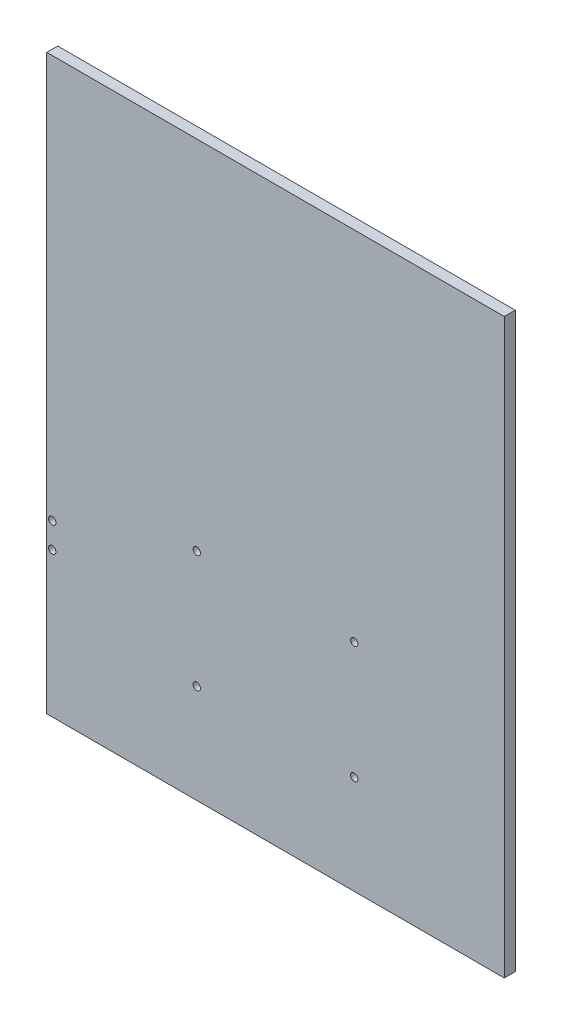
ISO-10303-21;
HEADER;
FILE_DESCRIPTION(('STEP AP214'),'2;1');
FILE_NAME('part.step','',(''),(''),'','','');
FILE_SCHEMA(('AUTOMOTIVE_DESIGN { 1 0 10303 214 1 1 1 1 }'));
ENDSEC;
DATA;
#1=APPLICATION_CONTEXT('core data for automotive mechanical design processes');
#2=APPLICATION_PROTOCOL_DEFINITION('international standard','automotive_design',2000,#1);
#3=PRODUCT_CONTEXT('',#1,'mechanical');
#4=PRODUCT('Part','Part','',(#3));
#5=PRODUCT_RELATED_PRODUCT_CATEGORY('part','',(#4));
#6=PRODUCT_DEFINITION_FORMATION('','',#4);
#7=PRODUCT_DEFINITION_CONTEXT('part definition',#1,'design');
#8=PRODUCT_DEFINITION('design','',#6,#7);
#9=PRODUCT_DEFINITION_SHAPE('','',#8);
#10=(LENGTH_UNIT() NAMED_UNIT(*) SI_UNIT(.MILLI.,.METRE.));
#11=(NAMED_UNIT(*) PLANE_ANGLE_UNIT() SI_UNIT($,.RADIAN.));
#12=(NAMED_UNIT(*) SI_UNIT($,.STERADIAN.) SOLID_ANGLE_UNIT());
#13=UNCERTAINTY_MEASURE_WITH_UNIT(LENGTH_MEASURE(1.E-05),#10,'distance_accuracy_value','');
#14=(GEOMETRIC_REPRESENTATION_CONTEXT(3) GLOBAL_UNCERTAINTY_ASSIGNED_CONTEXT((#13)) GLOBAL_UNIT_ASSIGNED_CONTEXT((#10,
#11,#12)) REPRESENTATION_CONTEXT('',''));
#15=CARTESIAN_POINT('',(0.,0.,0.));
#16=DIRECTION('',(0.,0.,1.));
#17=DIRECTION('',(1.,0.,0.));
#18=AXIS2_PLACEMENT_3D('',#15,#16,#17);
#19=CARTESIAN_POINT('',(-200.,141.,6.));
#20=DIRECTION('',(1.,0.,0.));
#21=DIRECTION('',(0.,1.,0.));
#22=AXIS2_PLACEMENT_3D('',#19,#20,#21);
#23=PLANE('',#22);
#24=DIRECTION('',(0.,-1.,0.));
#25=VECTOR('',#24,1.);
#26=CARTESIAN_POINT('',(-200.,141.,0.));
#27=LINE('',#26,#25);
#28=CARTESIAN_POINT('',(-200.,141.,0.));
#29=VERTEX_POINT('',#28);
#30=CARTESIAN_POINT('',(-200.,-172.,0.));
#31=VERTEX_POINT('',#30);
#32=EDGE_CURVE('E96',#29,#31,#27,.T.);
#33=ORIENTED_EDGE('',*,*,#32,.T.);
#34=DIRECTION('',(0.,0.,-1.));
#35=VECTOR('',#34,1.);
#36=CARTESIAN_POINT('',(-200.,-172.,6.));
#37=LINE('',#36,#35);
#38=CARTESIAN_POINT('',(-200.,-172.,6.));
#39=VERTEX_POINT('',#38);
#40=EDGE_CURVE('E11',#39,#31,#37,.T.);
#41=ORIENTED_EDGE('',*,*,#40,.F.);
#42=DIRECTION('',(0.,-1.,0.));
#43=VECTOR('',#42,1.);
#44=CARTESIAN_POINT('',(-200.,141.,6.));
#45=LINE('',#44,#43);
#46=CARTESIAN_POINT('',(-200.,141.,6.));
#47=VERTEX_POINT('',#46);
#48=EDGE_CURVE('E84',#47,#39,#45,.T.);
#49=ORIENTED_EDGE('',*,*,#48,.F.);
#50=DIRECTION('',(0.,0.,-1.));
#51=VECTOR('',#50,1.);
#52=CARTESIAN_POINT('',(-200.,141.,6.));
#53=LINE('',#52,#51);
#54=EDGE_CURVE('E92',#47,#29,#53,.T.);
#55=ORIENTED_EDGE('',*,*,#54,.T.);
#56=EDGE_LOOP('',(#33,#41,#49,#55));
#57=FACE_BOUND('',#56,.T.);
#58=ADVANCED_FACE('F33',(#57),#23,.F.);
#59=CARTESIAN_POINT('',(-200.,-172.,6.));
#60=DIRECTION('',(0.,1.,0.));
#61=DIRECTION('',(0.,0.,1.));
#62=AXIS2_PLACEMENT_3D('',#59,#60,#61);
#63=PLANE('',#62);
#64=DIRECTION('',(1.,0.,0.));
#65=VECTOR('',#64,1.);
#66=CARTESIAN_POINT('',(-200.,-172.,0.));
#67=LINE('',#66,#65);
#68=CARTESIAN_POINT('',(50.,-172.,0.));
#69=VERTEX_POINT('',#68);
#70=EDGE_CURVE('E88',#31,#69,#67,.T.);
#71=ORIENTED_EDGE('',*,*,#70,.T.);
#72=DIRECTION('',(0.,0.,-1.));
#73=VECTOR('',#72,1.);
#74=CARTESIAN_POINT('',(50.,-172.,6.));
#75=LINE('',#74,#73);
#76=CARTESIAN_POINT('',(50.,-172.,6.));
#77=VERTEX_POINT('',#76);
#78=EDGE_CURVE('E41',#77,#69,#75,.T.);
#79=ORIENTED_EDGE('',*,*,#78,.F.);
#80=DIRECTION('',(1.,0.,0.));
#81=VECTOR('',#80,1.);
#82=CARTESIAN_POINT('',(-200.,-172.,6.));
#83=LINE('',#82,#81);
#84=EDGE_CURVE('E79',#39,#77,#83,.T.);
#85=ORIENTED_EDGE('',*,*,#84,.F.);
#86=ORIENTED_EDGE('',*,*,#40,.T.);
#87=EDGE_LOOP('',(#71,#79,#85,#86));
#88=FACE_BOUND('',#87,.T.);
#89=ADVANCED_FACE('F87',(#88),#63,.F.);
#90=CARTESIAN_POINT('',(50.,141.,6.));
#91=DIRECTION('',(-1.,0.,0.));
#92=DIRECTION('',(0.,-1.,0.));
#93=AXIS2_PLACEMENT_3D('',#90,#91,#92);
#94=PLANE('',#93);
#95=DIRECTION('',(0.,1.,0.));
#96=VECTOR('',#95,1.);
#97=CARTESIAN_POINT('',(50.,141.,0.));
#98=LINE('',#97,#96);
#99=CARTESIAN_POINT('',(50.,141.,0.));
#100=VERTEX_POINT('',#99);
#101=EDGE_CURVE('E66',#69,#100,#98,.T.);
#102=ORIENTED_EDGE('',*,*,#101,.T.);
#103=DIRECTION('',(0.,0.,-1.));
#104=VECTOR('',#103,1.);
#105=CARTESIAN_POINT('',(50.,141.,6.));
#106=LINE('',#105,#104);
#107=CARTESIAN_POINT('',(50.,141.,6.));
#108=VERTEX_POINT('',#107);
#109=EDGE_CURVE('E89',#108,#100,#106,.T.);
#110=ORIENTED_EDGE('',*,*,#109,.F.);
#111=DIRECTION('',(0.,1.,0.));
#112=VECTOR('',#111,1.);
#113=CARTESIAN_POINT('',(50.,141.,6.));
#114=LINE('',#113,#112);
#115=EDGE_CURVE('E82',#77,#108,#114,.T.);
#116=ORIENTED_EDGE('',*,*,#115,.F.);
#117=ORIENTED_EDGE('',*,*,#78,.T.);
#118=EDGE_LOOP('',(#102,#110,#116,#117));
#119=FACE_BOUND('',#118,.T.);
#120=ADVANCED_FACE('F90',(#119),#94,.F.);
#121=CARTESIAN_POINT('',(-200.,141.,6.));
#122=DIRECTION('',(0.,-1.,0.));
#123=DIRECTION('',(0.,0.,-1.));
#124=AXIS2_PLACEMENT_3D('',#121,#122,#123);
#125=PLANE('',#124);
#126=DIRECTION('',(-1.,0.,0.));
#127=VECTOR('',#126,1.);
#128=CARTESIAN_POINT('',(-200.,141.,0.));
#129=LINE('',#128,#127);
#130=EDGE_CURVE('E72',#100,#29,#129,.T.);
#131=ORIENTED_EDGE('',*,*,#130,.T.);
#132=ORIENTED_EDGE('',*,*,#54,.F.);
#133=DIRECTION('',(-1.,0.,0.));
#134=VECTOR('',#133,1.);
#135=CARTESIAN_POINT('',(-200.,141.,6.));
#136=LINE('',#135,#134);
#137=EDGE_CURVE('E49',#108,#47,#136,.T.);
#138=ORIENTED_EDGE('',*,*,#137,.F.);
#139=ORIENTED_EDGE('',*,*,#109,.T.);
#140=EDGE_LOOP('',(#131,#132,#138,#139));
#141=FACE_BOUND('',#140,.T.);
#142=ADVANCED_FACE('F104',(#141),#125,.F.);
#143=CARTESIAN_POINT('',(0.,0.,6.));
#144=DIRECTION('',(0.,0.,1.));
#145=DIRECTION('',(1.,0.,0.));
#146=AXIS2_PLACEMENT_3D('',#143,#144,#145);
#147=PLANE('',#146);
#148=CARTESIAN_POINT('',(-197.,-79.1,6.));
#149=DIRECTION('',(0.,0.,1.));
#150=DIRECTION('',(1.,0.,0.));
#151=AXIS2_PLACEMENT_3D('',#148,#149,#150);
#152=CIRCLE('',#151,2.);
#153=CARTESIAN_POINT('',(-199.,-79.1,6.));
#154=VERTEX_POINT('',#153);
#155=EDGE_CURVE('E140',#154,#154,#152,.F.);
#156=ORIENTED_EDGE('',*,*,#155,.T.);
#157=EDGE_LOOP('',(#156));
#158=FACE_BOUND('',#157,.T.);
#159=CARTESIAN_POINT('',(-197.,-92.9,6.));
#160=DIRECTION('',(0.,0.,1.));
#161=DIRECTION('',(1.,0.,0.));
#162=AXIS2_PLACEMENT_3D('',#159,#160,#161);
#163=CIRCLE('',#162,2.);
#164=CARTESIAN_POINT('',(-199.,-92.9,6.));
#165=VERTEX_POINT('',#164);
#166=EDGE_CURVE('E134',#165,#165,#163,.F.);
#167=ORIENTED_EDGE('',*,*,#166,.T.);
#168=EDGE_LOOP('',(#167));
#169=FACE_BOUND('',#168,.T.);
#170=CARTESIAN_POINT('',(-32.,-118.,6.));
#171=DIRECTION('',(0.,0.,1.));
#172=DIRECTION('',(1.,0.,0.));
#173=AXIS2_PLACEMENT_3D('',#170,#171,#172);
#174=CIRCLE('',#173,2.);
#175=CARTESIAN_POINT('',(-34.,-118.,6.));
#176=VERTEX_POINT('',#175);
#177=EDGE_CURVE('E116',#176,#176,#174,.F.);
#178=ORIENTED_EDGE('',*,*,#177,.T.);
#179=EDGE_LOOP('',(#178));
#180=FACE_BOUND('',#179,.T.);
#181=CARTESIAN_POINT('',(-118.,-118.,6.));
#182=DIRECTION('',(0.,0.,1.));
#183=DIRECTION('',(1.,0.,0.));
#184=AXIS2_PLACEMENT_3D('',#181,#182,#183);
#185=CIRCLE('',#184,2.);
#186=CARTESIAN_POINT('',(-120.,-118.,6.));
#187=VERTEX_POINT('',#186);
#188=EDGE_CURVE('E123',#187,#187,#185,.F.);
#189=ORIENTED_EDGE('',*,*,#188,.T.);
#190=EDGE_LOOP('',(#189));
#191=FACE_BOUND('',#190,.T.);
#192=CARTESIAN_POINT('',(-118.,-54.,6.));
#193=DIRECTION('',(0.,0.,1.));
#194=DIRECTION('',(1.,0.,0.));
#195=AXIS2_PLACEMENT_3D('',#192,#193,#194);
#196=CIRCLE('',#195,2.);
#197=CARTESIAN_POINT('',(-120.,-54.,6.));
#198=VERTEX_POINT('',#197);
#199=EDGE_CURVE('E129',#198,#198,#196,.F.);
#200=ORIENTED_EDGE('',*,*,#199,.T.);
#201=EDGE_LOOP('',(#200));
#202=FACE_BOUND('',#201,.T.);
#203=CARTESIAN_POINT('',(-32.,-54.,6.));
#204=DIRECTION('',(0.,0.,1.));
#205=DIRECTION('',(1.,0.,0.));
#206=AXIS2_PLACEMENT_3D('',#203,#204,#205);
#207=CIRCLE('',#206,2.);
#208=CARTESIAN_POINT('',(-34.,-54.,6.));
#209=VERTEX_POINT('',#208);
#210=EDGE_CURVE('E110',#209,#209,#207,.F.);
#211=ORIENTED_EDGE('',*,*,#210,.T.);
#212=EDGE_LOOP('',(#211));
#213=FACE_BOUND('',#212,.T.);
#214=ORIENTED_EDGE('',*,*,#48,.T.);
#215=ORIENTED_EDGE('',*,*,#84,.T.);
#216=ORIENTED_EDGE('',*,*,#115,.T.);
#217=ORIENTED_EDGE('',*,*,#137,.T.);
#218=EDGE_LOOP('',(#214,#215,#216,#217));
#219=FACE_BOUND('',#218,.T.);
#220=ADVANCED_FACE('F80',(#158,#169,#180,#191,#202,#213,#219),#147,.T.);
#221=CARTESIAN_POINT('',(0.,0.,0.));
#222=DIRECTION('',(0.,0.,1.));
#223=DIRECTION('',(1.,0.,0.));
#224=AXIS2_PLACEMENT_3D('',#221,#222,#223);
#225=PLANE('',#224);
#226=CARTESIAN_POINT('',(-197.,-79.1,0.));
#227=DIRECTION('',(0.,0.,-1.));
#228=DIRECTION('',(-1.,0.,0.));
#229=AXIS2_PLACEMENT_3D('',#226,#227,#228);
#230=CIRCLE('',#229,2.);
#231=CARTESIAN_POINT('',(-199.,-79.1,0.));
#232=VERTEX_POINT('',#231);
#233=EDGE_CURVE('E120',#232,#232,#230,.T.);
#234=ORIENTED_EDGE('',*,*,#233,.F.);
#235=EDGE_LOOP('',(#234));
#236=FACE_BOUND('',#235,.T.);
#237=CARTESIAN_POINT('',(-197.,-92.9,0.));
#238=DIRECTION('',(0.,0.,-1.));
#239=DIRECTION('',(-1.,0.,0.));
#240=AXIS2_PLACEMENT_3D('',#237,#238,#239);
#241=CIRCLE('',#240,2.);
#242=CARTESIAN_POINT('',(-199.,-92.9,0.));
#243=VERTEX_POINT('',#242);
#244=EDGE_CURVE('E137',#243,#243,#241,.T.);
#245=ORIENTED_EDGE('',*,*,#244,.F.);
#246=EDGE_LOOP('',(#245));
#247=FACE_BOUND('',#246,.T.);
#248=CARTESIAN_POINT('',(-32.,-118.,0.));
#249=DIRECTION('',(0.,0.,-1.));
#250=DIRECTION('',(-1.,0.,0.));
#251=AXIS2_PLACEMENT_3D('',#248,#249,#250);
#252=CIRCLE('',#251,2.);
#253=CARTESIAN_POINT('',(-34.,-118.,0.));
#254=VERTEX_POINT('',#253);
#255=EDGE_CURVE('E119',#254,#254,#252,.T.);
#256=ORIENTED_EDGE('',*,*,#255,.F.);
#257=EDGE_LOOP('',(#256));
#258=FACE_BOUND('',#257,.T.);
#259=CARTESIAN_POINT('',(-118.,-118.,0.));
#260=DIRECTION('',(0.,0.,-1.));
#261=DIRECTION('',(-1.,0.,0.));
#262=AXIS2_PLACEMENT_3D('',#259,#260,#261);
#263=CIRCLE('',#262,2.);
#264=CARTESIAN_POINT('',(-120.,-118.,0.));
#265=VERTEX_POINT('',#264);
#266=EDGE_CURVE('E126',#265,#265,#263,.T.);
#267=ORIENTED_EDGE('',*,*,#266,.F.);
#268=EDGE_LOOP('',(#267));
#269=FACE_BOUND('',#268,.T.);
#270=CARTESIAN_POINT('',(-118.,-54.,0.));
#271=DIRECTION('',(0.,0.,-1.));
#272=DIRECTION('',(-1.,0.,0.));
#273=AXIS2_PLACEMENT_3D('',#270,#271,#272);
#274=CIRCLE('',#273,2.);
#275=CARTESIAN_POINT('',(-120.,-54.,0.));
#276=VERTEX_POINT('',#275);
#277=EDGE_CURVE('E113',#276,#276,#274,.T.);
#278=ORIENTED_EDGE('',*,*,#277,.F.);
#279=EDGE_LOOP('',(#278));
#280=FACE_BOUND('',#279,.T.);
#281=CARTESIAN_POINT('',(-32.,-54.,0.));
#282=DIRECTION('',(0.,0.,-1.));
#283=DIRECTION('',(-1.,0.,0.));
#284=AXIS2_PLACEMENT_3D('',#281,#282,#283);
#285=CIRCLE('',#284,2.);
#286=CARTESIAN_POINT('',(-34.,-54.,0.));
#287=VERTEX_POINT('',#286);
#288=EDGE_CURVE('E99',#287,#287,#285,.T.);
#289=ORIENTED_EDGE('',*,*,#288,.F.);
#290=EDGE_LOOP('',(#289));
#291=FACE_BOUND('',#290,.T.);
#292=ORIENTED_EDGE('',*,*,#32,.F.);
#293=ORIENTED_EDGE('',*,*,#130,.F.);
#294=ORIENTED_EDGE('',*,*,#101,.F.);
#295=ORIENTED_EDGE('',*,*,#70,.F.);
#296=EDGE_LOOP('',(#292,#293,#294,#295));
#297=FACE_BOUND('',#296,.T.);
#298=ADVANCED_FACE('F107',(#236,#247,#258,#269,#280,#291,#297),#225,.F.);
#299=CARTESIAN_POINT('',(-32.,-54.,6.001));
#300=DIRECTION('',(0.,0.,-1.));
#301=DIRECTION('',(-1.,0.,0.));
#302=AXIS2_PLACEMENT_3D('',#299,#300,#301);
#303=CYLINDRICAL_SURFACE('',#302,2.);
#304=CARTESIAN_POINT('',(-34.,-54.,6.));
#305=CARTESIAN_POINT('',(-34.,-54.,5.9375));
#306=CARTESIAN_POINT('',(-34.,-54.,5.875));
#307=CARTESIAN_POINT('',(-34.,-54.,5.75));
#308=CARTESIAN_POINT('',(-34.,-54.,5.6875));
#309=CARTESIAN_POINT('',(-34.,-54.,5.5625));
#310=CARTESIAN_POINT('',(-34.,-54.,5.5));
#311=CARTESIAN_POINT('',(-34.,-54.,5.375));
#312=CARTESIAN_POINT('',(-34.,-54.,5.3125));
#313=CARTESIAN_POINT('',(-34.,-54.,5.1875));
#314=CARTESIAN_POINT('',(-34.,-54.,5.125));
#315=CARTESIAN_POINT('',(-34.,-54.,5.));
#316=CARTESIAN_POINT('',(-34.,-54.,4.9375));
#317=CARTESIAN_POINT('',(-34.,-54.,4.8125));
#318=CARTESIAN_POINT('',(-34.,-54.,4.75));
#319=CARTESIAN_POINT('',(-34.,-54.,4.625));
#320=CARTESIAN_POINT('',(-34.,-54.,4.5625));
#321=CARTESIAN_POINT('',(-34.,-54.,4.4375));
#322=CARTESIAN_POINT('',(-34.,-54.,4.375));
#323=CARTESIAN_POINT('',(-34.,-54.,4.25));
#324=CARTESIAN_POINT('',(-34.,-54.,4.1875));
#325=CARTESIAN_POINT('',(-34.,-54.,4.0625));
#326=CARTESIAN_POINT('',(-34.,-54.,4.));
#327=CARTESIAN_POINT('',(-34.,-54.,3.875));
#328=CARTESIAN_POINT('',(-34.,-54.,3.8125));
#329=CARTESIAN_POINT('',(-34.,-54.,3.6875));
#330=CARTESIAN_POINT('',(-34.,-54.,3.625));
#331=CARTESIAN_POINT('',(-34.,-54.,3.5));
#332=CARTESIAN_POINT('',(-34.,-54.,3.4375));
#333=CARTESIAN_POINT('',(-34.,-54.,3.3125));
#334=CARTESIAN_POINT('',(-34.,-54.,3.25));
#335=CARTESIAN_POINT('',(-34.,-54.,3.125));
#336=CARTESIAN_POINT('',(-34.,-54.,3.0625));
#337=CARTESIAN_POINT('',(-34.,-54.,2.9375));
#338=CARTESIAN_POINT('',(-34.,-54.,2.875));
#339=CARTESIAN_POINT('',(-34.,-54.,2.75));
#340=CARTESIAN_POINT('',(-34.,-54.,2.6875));
#341=CARTESIAN_POINT('',(-34.,-54.,2.5625));
#342=CARTESIAN_POINT('',(-34.,-54.,2.5));
#343=CARTESIAN_POINT('',(-34.,-54.,2.375));
#344=CARTESIAN_POINT('',(-34.,-54.,2.3125));
#345=CARTESIAN_POINT('',(-34.,-54.,2.1875));
#346=CARTESIAN_POINT('',(-34.,-54.,2.125));
#347=CARTESIAN_POINT('',(-34.,-54.,2.));
#348=CARTESIAN_POINT('',(-34.,-54.,1.9375));
#349=CARTESIAN_POINT('',(-34.,-54.,1.8125));
#350=CARTESIAN_POINT('',(-34.,-54.,1.75));
#351=CARTESIAN_POINT('',(-34.,-54.,1.625));
#352=CARTESIAN_POINT('',(-34.,-54.,1.5625));
#353=CARTESIAN_POINT('',(-34.,-54.,1.4375));
#354=CARTESIAN_POINT('',(-34.,-54.,1.375));
#355=CARTESIAN_POINT('',(-34.,-54.,1.25));
#356=CARTESIAN_POINT('',(-34.,-54.,1.1875));
#357=CARTESIAN_POINT('',(-34.,-54.,1.0625));
#358=CARTESIAN_POINT('',(-34.,-54.,1.));
#359=CARTESIAN_POINT('',(-34.,-54.,0.875));
#360=CARTESIAN_POINT('',(-34.,-54.,0.8125));
#361=CARTESIAN_POINT('',(-34.,-54.,0.6875));
#362=CARTESIAN_POINT('',(-34.,-54.,0.625));
#363=CARTESIAN_POINT('',(-34.,-54.,0.5));
#364=CARTESIAN_POINT('',(-34.,-54.,0.4375));
#365=CARTESIAN_POINT('',(-34.,-54.,0.3125));
#366=CARTESIAN_POINT('',(-34.,-54.,0.25));
#367=CARTESIAN_POINT('',(-34.,-54.,0.125));
#368=CARTESIAN_POINT('',(-34.,-54.,0.0625000000000001));
#369=CARTESIAN_POINT('',(-34.,-54.,0.));
#370=B_SPLINE_CURVE_WITH_KNOTS('',3,(#304,#305,#306,#307,#308,#309,#310,#311,#312,#313,#314,
#315,#316,#317,#318,#319,#320,#321,#322,#323,#324,#325,#326,#327,#328,#329,#330,#331,#332,#333,
#334,#335,#336,#337,#338,#339,#340,#341,#342,#343,#344,#345,#346,#347,#348,#349,#350,#351,#352,
#353,#354,#355,#356,#357,#358,#359,#360,#361,#362,#363,#364,#365,#366,#367,#368,#369),
.UNSPECIFIED.,.F.,.F.,(4,2,2,2,2,2,2,2,2,2,2,2,2,2,2,2,2,2,2,2,2,2,2,2,2,2,2,2,2,2,2,2,4),(0.,
0.187499999999999,0.374999999999999,0.5625,0.75,0.937499999999999,1.125,1.3125,1.5,1.6875,1.875,
2.0625,2.25,2.4375,2.625,2.8125,3.,3.1875,3.375,3.5625,3.75,3.9375,4.125,4.3125,4.5,4.6875,
4.875,5.0625,5.25,5.4375,5.625,5.8125,6.),.UNSPECIFIED.);
#371=EDGE_CURVE('BSEAM150',#209,#287,#370,.T.);
#372=ORIENTED_EDGE('',*,*,#210,.F.);
#373=ORIENTED_EDGE('',*,*,#288,.T.);
#374=ORIENTED_EDGE('',*,*,#371,.T.);
#375=ORIENTED_EDGE('',*,*,#371,.F.);
#376=EDGE_LOOP('',(#372,#374,#373,#375));
#377=FACE_BOUND('',#376,.T.);
#378=ADVANCED_FACE('F150',(#377),#303,.F.);
#379=CARTESIAN_POINT('',(-118.,-54.,6.001));
#380=DIRECTION('',(0.,0.,-1.));
#381=DIRECTION('',(-1.,0.,0.));
#382=AXIS2_PLACEMENT_3D('',#379,#380,#381);
#383=CYLINDRICAL_SURFACE('',#382,2.);
#384=CARTESIAN_POINT('',(-120.,-54.,6.));
#385=CARTESIAN_POINT('',(-120.,-54.,5.9375));
#386=CARTESIAN_POINT('',(-120.,-54.,5.875));
#387=CARTESIAN_POINT('',(-120.,-54.,5.75));
#388=CARTESIAN_POINT('',(-120.,-54.,5.6875));
#389=CARTESIAN_POINT('',(-120.,-54.,5.5625));
#390=CARTESIAN_POINT('',(-120.,-54.,5.5));
#391=CARTESIAN_POINT('',(-120.,-54.,5.375));
#392=CARTESIAN_POINT('',(-120.,-54.,5.3125));
#393=CARTESIAN_POINT('',(-120.,-54.,5.1875));
#394=CARTESIAN_POINT('',(-120.,-54.,5.125));
#395=CARTESIAN_POINT('',(-120.,-54.,5.));
#396=CARTESIAN_POINT('',(-120.,-54.,4.9375));
#397=CARTESIAN_POINT('',(-120.,-54.,4.8125));
#398=CARTESIAN_POINT('',(-120.,-54.,4.75));
#399=CARTESIAN_POINT('',(-120.,-54.,4.625));
#400=CARTESIAN_POINT('',(-120.,-54.,4.5625));
#401=CARTESIAN_POINT('',(-120.,-54.,4.4375));
#402=CARTESIAN_POINT('',(-120.,-54.,4.375));
#403=CARTESIAN_POINT('',(-120.,-54.,4.25));
#404=CARTESIAN_POINT('',(-120.,-54.,4.1875));
#405=CARTESIAN_POINT('',(-120.,-54.,4.0625));
#406=CARTESIAN_POINT('',(-120.,-54.,4.));
#407=CARTESIAN_POINT('',(-120.,-54.,3.875));
#408=CARTESIAN_POINT('',(-120.,-54.,3.8125));
#409=CARTESIAN_POINT('',(-120.,-54.,3.6875));
#410=CARTESIAN_POINT('',(-120.,-54.,3.625));
#411=CARTESIAN_POINT('',(-120.,-54.,3.5));
#412=CARTESIAN_POINT('',(-120.,-54.,3.4375));
#413=CARTESIAN_POINT('',(-120.,-54.,3.3125));
#414=CARTESIAN_POINT('',(-120.,-54.,3.25));
#415=CARTESIAN_POINT('',(-120.,-54.,3.125));
#416=CARTESIAN_POINT('',(-120.,-54.,3.0625));
#417=CARTESIAN_POINT('',(-120.,-54.,2.9375));
#418=CARTESIAN_POINT('',(-120.,-54.,2.875));
#419=CARTESIAN_POINT('',(-120.,-54.,2.75));
#420=CARTESIAN_POINT('',(-120.,-54.,2.6875));
#421=CARTESIAN_POINT('',(-120.,-54.,2.5625));
#422=CARTESIAN_POINT('',(-120.,-54.,2.5));
#423=CARTESIAN_POINT('',(-120.,-54.,2.375));
#424=CARTESIAN_POINT('',(-120.,-54.,2.3125));
#425=CARTESIAN_POINT('',(-120.,-54.,2.1875));
#426=CARTESIAN_POINT('',(-120.,-54.,2.125));
#427=CARTESIAN_POINT('',(-120.,-54.,2.));
#428=CARTESIAN_POINT('',(-120.,-54.,1.9375));
#429=CARTESIAN_POINT('',(-120.,-54.,1.8125));
#430=CARTESIAN_POINT('',(-120.,-54.,1.75));
#431=CARTESIAN_POINT('',(-120.,-54.,1.625));
#432=CARTESIAN_POINT('',(-120.,-54.,1.5625));
#433=CARTESIAN_POINT('',(-120.,-54.,1.4375));
#434=CARTESIAN_POINT('',(-120.,-54.,1.375));
#435=CARTESIAN_POINT('',(-120.,-54.,1.25));
#436=CARTESIAN_POINT('',(-120.,-54.,1.1875));
#437=CARTESIAN_POINT('',(-120.,-54.,1.0625));
#438=CARTESIAN_POINT('',(-120.,-54.,1.));
#439=CARTESIAN_POINT('',(-120.,-54.,0.875));
#440=CARTESIAN_POINT('',(-120.,-54.,0.8125));
#441=CARTESIAN_POINT('',(-120.,-54.,0.6875));
#442=CARTESIAN_POINT('',(-120.,-54.,0.625));
#443=CARTESIAN_POINT('',(-120.,-54.,0.5));
#444=CARTESIAN_POINT('',(-120.,-54.,0.4375));
#445=CARTESIAN_POINT('',(-120.,-54.,0.3125));
#446=CARTESIAN_POINT('',(-120.,-54.,0.25));
#447=CARTESIAN_POINT('',(-120.,-54.,0.125));
#448=CARTESIAN_POINT('',(-120.,-54.,0.0625000000000001));
#449=CARTESIAN_POINT('',(-120.,-54.,0.));
#450=B_SPLINE_CURVE_WITH_KNOTS('',3,(#384,#385,#386,#387,#388,#389,#390,#391,#392,#393,#394,
#395,#396,#397,#398,#399,#400,#401,#402,#403,#404,#405,#406,#407,#408,#409,#410,#411,#412,#413,
#414,#415,#416,#417,#418,#419,#420,#421,#422,#423,#424,#425,#426,#427,#428,#429,#430,#431,#432,
#433,#434,#435,#436,#437,#438,#439,#440,#441,#442,#443,#444,#445,#446,#447,#448,#449),
.UNSPECIFIED.,.F.,.F.,(4,2,2,2,2,2,2,2,2,2,2,2,2,2,2,2,2,2,2,2,2,2,2,2,2,2,2,2,2,2,2,2,4),(0.,
0.187499999999999,0.374999999999999,0.5625,0.75,0.937499999999999,1.125,1.3125,1.5,1.6875,1.875,
2.0625,2.25,2.4375,2.625,2.8125,3.,3.1875,3.375,3.5625,3.75,3.9375,4.125,4.3125,4.5,4.6875,
4.875,5.0625,5.25,5.4375,5.625,5.8125,6.),.UNSPECIFIED.);
#451=EDGE_CURVE('BSEAM163',#198,#276,#450,.T.);
#452=ORIENTED_EDGE('',*,*,#199,.F.);
#453=ORIENTED_EDGE('',*,*,#277,.T.);
#454=ORIENTED_EDGE('',*,*,#451,.T.);
#455=ORIENTED_EDGE('',*,*,#451,.F.);
#456=EDGE_LOOP('',(#452,#454,#453,#455));
#457=FACE_BOUND('',#456,.T.);
#458=ADVANCED_FACE('F163',(#457),#383,.F.);
#459=CARTESIAN_POINT('',(-118.,-118.,6.001));
#460=DIRECTION('',(0.,0.,-1.));
#461=DIRECTION('',(-1.,0.,0.));
#462=AXIS2_PLACEMENT_3D('',#459,#460,#461);
#463=CYLINDRICAL_SURFACE('',#462,2.);
#464=CARTESIAN_POINT('',(-120.,-118.,6.));
#465=CARTESIAN_POINT('',(-120.,-118.,5.9375));
#466=CARTESIAN_POINT('',(-120.,-118.,5.875));
#467=CARTESIAN_POINT('',(-120.,-118.,5.75));
#468=CARTESIAN_POINT('',(-120.,-118.,5.6875));
#469=CARTESIAN_POINT('',(-120.,-118.,5.5625));
#470=CARTESIAN_POINT('',(-120.,-118.,5.5));
#471=CARTESIAN_POINT('',(-120.,-118.,5.375));
#472=CARTESIAN_POINT('',(-120.,-118.,5.3125));
#473=CARTESIAN_POINT('',(-120.,-118.,5.1875));
#474=CARTESIAN_POINT('',(-120.,-118.,5.125));
#475=CARTESIAN_POINT('',(-120.,-118.,5.));
#476=CARTESIAN_POINT('',(-120.,-118.,4.9375));
#477=CARTESIAN_POINT('',(-120.,-118.,4.8125));
#478=CARTESIAN_POINT('',(-120.,-118.,4.75));
#479=CARTESIAN_POINT('',(-120.,-118.,4.625));
#480=CARTESIAN_POINT('',(-120.,-118.,4.5625));
#481=CARTESIAN_POINT('',(-120.,-118.,4.4375));
#482=CARTESIAN_POINT('',(-120.,-118.,4.375));
#483=CARTESIAN_POINT('',(-120.,-118.,4.25));
#484=CARTESIAN_POINT('',(-120.,-118.,4.1875));
#485=CARTESIAN_POINT('',(-120.,-118.,4.0625));
#486=CARTESIAN_POINT('',(-120.,-118.,4.));
#487=CARTESIAN_POINT('',(-120.,-118.,3.875));
#488=CARTESIAN_POINT('',(-120.,-118.,3.8125));
#489=CARTESIAN_POINT('',(-120.,-118.,3.6875));
#490=CARTESIAN_POINT('',(-120.,-118.,3.625));
#491=CARTESIAN_POINT('',(-120.,-118.,3.5));
#492=CARTESIAN_POINT('',(-120.,-118.,3.4375));
#493=CARTESIAN_POINT('',(-120.,-118.,3.3125));
#494=CARTESIAN_POINT('',(-120.,-118.,3.25));
#495=CARTESIAN_POINT('',(-120.,-118.,3.125));
#496=CARTESIAN_POINT('',(-120.,-118.,3.0625));
#497=CARTESIAN_POINT('',(-120.,-118.,2.9375));
#498=CARTESIAN_POINT('',(-120.,-118.,2.875));
#499=CARTESIAN_POINT('',(-120.,-118.,2.75));
#500=CARTESIAN_POINT('',(-120.,-118.,2.6875));
#501=CARTESIAN_POINT('',(-120.,-118.,2.5625));
#502=CARTESIAN_POINT('',(-120.,-118.,2.5));
#503=CARTESIAN_POINT('',(-120.,-118.,2.375));
#504=CARTESIAN_POINT('',(-120.,-118.,2.3125));
#505=CARTESIAN_POINT('',(-120.,-118.,2.1875));
#506=CARTESIAN_POINT('',(-120.,-118.,2.125));
#507=CARTESIAN_POINT('',(-120.,-118.,2.));
#508=CARTESIAN_POINT('',(-120.,-118.,1.9375));
#509=CARTESIAN_POINT('',(-120.,-118.,1.8125));
#510=CARTESIAN_POINT('',(-120.,-118.,1.75));
#511=CARTESIAN_POINT('',(-120.,-118.,1.625));
#512=CARTESIAN_POINT('',(-120.,-118.,1.5625));
#513=CARTESIAN_POINT('',(-120.,-118.,1.4375));
#514=CARTESIAN_POINT('',(-120.,-118.,1.375));
#515=CARTESIAN_POINT('',(-120.,-118.,1.25));
#516=CARTESIAN_POINT('',(-120.,-118.,1.1875));
#517=CARTESIAN_POINT('',(-120.,-118.,1.0625));
#518=CARTESIAN_POINT('',(-120.,-118.,1.));
#519=CARTESIAN_POINT('',(-120.,-118.,0.875));
#520=CARTESIAN_POINT('',(-120.,-118.,0.8125));
#521=CARTESIAN_POINT('',(-120.,-118.,0.6875));
#522=CARTESIAN_POINT('',(-120.,-118.,0.625));
#523=CARTESIAN_POINT('',(-120.,-118.,0.5));
#524=CARTESIAN_POINT('',(-120.,-118.,0.4375));
#525=CARTESIAN_POINT('',(-120.,-118.,0.3125));
#526=CARTESIAN_POINT('',(-120.,-118.,0.25));
#527=CARTESIAN_POINT('',(-120.,-118.,0.125));
#528=CARTESIAN_POINT('',(-120.,-118.,0.0625000000000001));
#529=CARTESIAN_POINT('',(-120.,-118.,0.));
#530=B_SPLINE_CURVE_WITH_KNOTS('',3,(#464,#465,#466,#467,#468,#469,#470,#471,#472,#473,#474,
#475,#476,#477,#478,#479,#480,#481,#482,#483,#484,#485,#486,#487,#488,#489,#490,#491,#492,#493,
#494,#495,#496,#497,#498,#499,#500,#501,#502,#503,#504,#505,#506,#507,#508,#509,#510,#511,#512,
#513,#514,#515,#516,#517,#518,#519,#520,#521,#522,#523,#524,#525,#526,#527,#528,#529),
.UNSPECIFIED.,.F.,.F.,(4,2,2,2,2,2,2,2,2,2,2,2,2,2,2,2,2,2,2,2,2,2,2,2,2,2,2,2,2,2,2,2,4),(0.,
0.187499999999999,0.374999999999999,0.5625,0.75,0.937499999999999,1.125,1.3125,1.5,1.6875,1.875,
2.0625,2.25,2.4375,2.625,2.8125,3.,3.1875,3.375,3.5625,3.75,3.9375,4.125,4.3125,4.5,4.6875,
4.875,5.0625,5.25,5.4375,5.625,5.8125,6.),.UNSPECIFIED.);
#531=EDGE_CURVE('BSEAM170',#187,#265,#530,.T.);
#532=ORIENTED_EDGE('',*,*,#188,.F.);
#533=ORIENTED_EDGE('',*,*,#266,.T.);
#534=ORIENTED_EDGE('',*,*,#531,.T.);
#535=ORIENTED_EDGE('',*,*,#531,.F.);
#536=EDGE_LOOP('',(#532,#534,#533,#535));
#537=FACE_BOUND('',#536,.T.);
#538=ADVANCED_FACE('F170',(#537),#463,.F.);
#539=CARTESIAN_POINT('',(-32.,-118.,6.001));
#540=DIRECTION('',(0.,0.,-1.));
#541=DIRECTION('',(-1.,0.,0.));
#542=AXIS2_PLACEMENT_3D('',#539,#540,#541);
#543=CYLINDRICAL_SURFACE('',#542,2.);
#544=CARTESIAN_POINT('',(-34.,-118.,6.));
#545=CARTESIAN_POINT('',(-34.,-118.,5.9375));
#546=CARTESIAN_POINT('',(-34.,-118.,5.875));
#547=CARTESIAN_POINT('',(-34.,-118.,5.75));
#548=CARTESIAN_POINT('',(-34.,-118.,5.6875));
#549=CARTESIAN_POINT('',(-34.,-118.,5.5625));
#550=CARTESIAN_POINT('',(-34.,-118.,5.5));
#551=CARTESIAN_POINT('',(-34.,-118.,5.375));
#552=CARTESIAN_POINT('',(-34.,-118.,5.3125));
#553=CARTESIAN_POINT('',(-34.,-118.,5.1875));
#554=CARTESIAN_POINT('',(-34.,-118.,5.125));
#555=CARTESIAN_POINT('',(-34.,-118.,5.));
#556=CARTESIAN_POINT('',(-34.,-118.,4.9375));
#557=CARTESIAN_POINT('',(-34.,-118.,4.8125));
#558=CARTESIAN_POINT('',(-34.,-118.,4.75));
#559=CARTESIAN_POINT('',(-34.,-118.,4.625));
#560=CARTESIAN_POINT('',(-34.,-118.,4.5625));
#561=CARTESIAN_POINT('',(-34.,-118.,4.4375));
#562=CARTESIAN_POINT('',(-34.,-118.,4.375));
#563=CARTESIAN_POINT('',(-34.,-118.,4.25));
#564=CARTESIAN_POINT('',(-34.,-118.,4.1875));
#565=CARTESIAN_POINT('',(-34.,-118.,4.0625));
#566=CARTESIAN_POINT('',(-34.,-118.,4.));
#567=CARTESIAN_POINT('',(-34.,-118.,3.875));
#568=CARTESIAN_POINT('',(-34.,-118.,3.8125));
#569=CARTESIAN_POINT('',(-34.,-118.,3.6875));
#570=CARTESIAN_POINT('',(-34.,-118.,3.625));
#571=CARTESIAN_POINT('',(-34.,-118.,3.5));
#572=CARTESIAN_POINT('',(-34.,-118.,3.4375));
#573=CARTESIAN_POINT('',(-34.,-118.,3.3125));
#574=CARTESIAN_POINT('',(-34.,-118.,3.25));
#575=CARTESIAN_POINT('',(-34.,-118.,3.125));
#576=CARTESIAN_POINT('',(-34.,-118.,3.0625));
#577=CARTESIAN_POINT('',(-34.,-118.,2.9375));
#578=CARTESIAN_POINT('',(-34.,-118.,2.875));
#579=CARTESIAN_POINT('',(-34.,-118.,2.75));
#580=CARTESIAN_POINT('',(-34.,-118.,2.6875));
#581=CARTESIAN_POINT('',(-34.,-118.,2.5625));
#582=CARTESIAN_POINT('',(-34.,-118.,2.5));
#583=CARTESIAN_POINT('',(-34.,-118.,2.375));
#584=CARTESIAN_POINT('',(-34.,-118.,2.3125));
#585=CARTESIAN_POINT('',(-34.,-118.,2.1875));
#586=CARTESIAN_POINT('',(-34.,-118.,2.125));
#587=CARTESIAN_POINT('',(-34.,-118.,2.));
#588=CARTESIAN_POINT('',(-34.,-118.,1.9375));
#589=CARTESIAN_POINT('',(-34.,-118.,1.8125));
#590=CARTESIAN_POINT('',(-34.,-118.,1.75));
#591=CARTESIAN_POINT('',(-34.,-118.,1.625));
#592=CARTESIAN_POINT('',(-34.,-118.,1.5625));
#593=CARTESIAN_POINT('',(-34.,-118.,1.4375));
#594=CARTESIAN_POINT('',(-34.,-118.,1.375));
#595=CARTESIAN_POINT('',(-34.,-118.,1.25));
#596=CARTESIAN_POINT('',(-34.,-118.,1.1875));
#597=CARTESIAN_POINT('',(-34.,-118.,1.0625));
#598=CARTESIAN_POINT('',(-34.,-118.,1.));
#599=CARTESIAN_POINT('',(-34.,-118.,0.875));
#600=CARTESIAN_POINT('',(-34.,-118.,0.8125));
#601=CARTESIAN_POINT('',(-34.,-118.,0.6875));
#602=CARTESIAN_POINT('',(-34.,-118.,0.625));
#603=CARTESIAN_POINT('',(-34.,-118.,0.5));
#604=CARTESIAN_POINT('',(-34.,-118.,0.4375));
#605=CARTESIAN_POINT('',(-34.,-118.,0.3125));
#606=CARTESIAN_POINT('',(-34.,-118.,0.25));
#607=CARTESIAN_POINT('',(-34.,-118.,0.125));
#608=CARTESIAN_POINT('',(-34.,-118.,0.0625000000000001));
#609=CARTESIAN_POINT('',(-34.,-118.,0.));
#610=B_SPLINE_CURVE_WITH_KNOTS('',3,(#544,#545,#546,#547,#548,#549,#550,#551,#552,#553,#554,
#555,#556,#557,#558,#559,#560,#561,#562,#563,#564,#565,#566,#567,#568,#569,#570,#571,#572,#573,
#574,#575,#576,#577,#578,#579,#580,#581,#582,#583,#584,#585,#586,#587,#588,#589,#590,#591,#592,
#593,#594,#595,#596,#597,#598,#599,#600,#601,#602,#603,#604,#605,#606,#607,#608,#609),
.UNSPECIFIED.,.F.,.F.,(4,2,2,2,2,2,2,2,2,2,2,2,2,2,2,2,2,2,2,2,2,2,2,2,2,2,2,2,2,2,2,2,4),(0.,
0.187499999999999,0.374999999999999,0.5625,0.75,0.937499999999999,1.125,1.3125,1.5,1.6875,1.875,
2.0625,2.25,2.4375,2.625,2.8125,3.,3.1875,3.375,3.5625,3.75,3.9375,4.125,4.3125,4.5,4.6875,
4.875,5.0625,5.25,5.4375,5.625,5.8125,6.),.UNSPECIFIED.);
#611=EDGE_CURVE('BSEAM205',#176,#254,#610,.T.);
#612=ORIENTED_EDGE('',*,*,#177,.F.);
#613=ORIENTED_EDGE('',*,*,#255,.T.);
#614=ORIENTED_EDGE('',*,*,#611,.T.);
#615=ORIENTED_EDGE('',*,*,#611,.F.);
#616=EDGE_LOOP('',(#612,#614,#613,#615));
#617=FACE_BOUND('',#616,.T.);
#618=ADVANCED_FACE('F205',(#617),#543,.F.);
#619=CARTESIAN_POINT('',(-197.,-92.9,6.001));
#620=DIRECTION('',(0.,0.,-1.));
#621=DIRECTION('',(-1.,0.,0.));
#622=AXIS2_PLACEMENT_3D('',#619,#620,#621);
#623=CYLINDRICAL_SURFACE('',#622,2.);
#624=CARTESIAN_POINT('',(-199.,-92.9,6.));
#625=CARTESIAN_POINT('',(-199.,-92.9,5.9375));
#626=CARTESIAN_POINT('',(-199.,-92.9,5.875));
#627=CARTESIAN_POINT('',(-199.,-92.9,5.75));
#628=CARTESIAN_POINT('',(-199.,-92.9,5.6875));
#629=CARTESIAN_POINT('',(-199.,-92.9,5.5625));
#630=CARTESIAN_POINT('',(-199.,-92.9,5.5));
#631=CARTESIAN_POINT('',(-199.,-92.9,5.375));
#632=CARTESIAN_POINT('',(-199.,-92.9,5.3125));
#633=CARTESIAN_POINT('',(-199.,-92.9,5.1875));
#634=CARTESIAN_POINT('',(-199.,-92.9,5.125));
#635=CARTESIAN_POINT('',(-199.,-92.9,5.));
#636=CARTESIAN_POINT('',(-199.,-92.9,4.9375));
#637=CARTESIAN_POINT('',(-199.,-92.9,4.8125));
#638=CARTESIAN_POINT('',(-199.,-92.9,4.75));
#639=CARTESIAN_POINT('',(-199.,-92.9,4.625));
#640=CARTESIAN_POINT('',(-199.,-92.9,4.5625));
#641=CARTESIAN_POINT('',(-199.,-92.9,4.4375));
#642=CARTESIAN_POINT('',(-199.,-92.9,4.375));
#643=CARTESIAN_POINT('',(-199.,-92.9,4.25));
#644=CARTESIAN_POINT('',(-199.,-92.9,4.1875));
#645=CARTESIAN_POINT('',(-199.,-92.9,4.0625));
#646=CARTESIAN_POINT('',(-199.,-92.9,4.));
#647=CARTESIAN_POINT('',(-199.,-92.9,3.875));
#648=CARTESIAN_POINT('',(-199.,-92.9,3.8125));
#649=CARTESIAN_POINT('',(-199.,-92.9,3.6875));
#650=CARTESIAN_POINT('',(-199.,-92.9,3.625));
#651=CARTESIAN_POINT('',(-199.,-92.9,3.5));
#652=CARTESIAN_POINT('',(-199.,-92.9,3.4375));
#653=CARTESIAN_POINT('',(-199.,-92.9,3.3125));
#654=CARTESIAN_POINT('',(-199.,-92.9,3.25));
#655=CARTESIAN_POINT('',(-199.,-92.9,3.125));
#656=CARTESIAN_POINT('',(-199.,-92.9,3.0625));
#657=CARTESIAN_POINT('',(-199.,-92.9,2.9375));
#658=CARTESIAN_POINT('',(-199.,-92.9,2.875));
#659=CARTESIAN_POINT('',(-199.,-92.9,2.75));
#660=CARTESIAN_POINT('',(-199.,-92.9,2.6875));
#661=CARTESIAN_POINT('',(-199.,-92.9,2.5625));
#662=CARTESIAN_POINT('',(-199.,-92.9,2.5));
#663=CARTESIAN_POINT('',(-199.,-92.9,2.375));
#664=CARTESIAN_POINT('',(-199.,-92.9,2.3125));
#665=CARTESIAN_POINT('',(-199.,-92.9,2.1875));
#666=CARTESIAN_POINT('',(-199.,-92.9,2.125));
#667=CARTESIAN_POINT('',(-199.,-92.9,2.));
#668=CARTESIAN_POINT('',(-199.,-92.9,1.9375));
#669=CARTESIAN_POINT('',(-199.,-92.9,1.8125));
#670=CARTESIAN_POINT('',(-199.,-92.9,1.75));
#671=CARTESIAN_POINT('',(-199.,-92.9,1.625));
#672=CARTESIAN_POINT('',(-199.,-92.9,1.5625));
#673=CARTESIAN_POINT('',(-199.,-92.9,1.4375));
#674=CARTESIAN_POINT('',(-199.,-92.9,1.375));
#675=CARTESIAN_POINT('',(-199.,-92.9,1.25));
#676=CARTESIAN_POINT('',(-199.,-92.9,1.1875));
#677=CARTESIAN_POINT('',(-199.,-92.9,1.0625));
#678=CARTESIAN_POINT('',(-199.,-92.9,1.));
#679=CARTESIAN_POINT('',(-199.,-92.9,0.875));
#680=CARTESIAN_POINT('',(-199.,-92.9,0.8125));
#681=CARTESIAN_POINT('',(-199.,-92.9,0.6875));
#682=CARTESIAN_POINT('',(-199.,-92.9,0.625));
#683=CARTESIAN_POINT('',(-199.,-92.9,0.5));
#684=CARTESIAN_POINT('',(-199.,-92.9,0.4375));
#685=CARTESIAN_POINT('',(-199.,-92.9,0.3125));
#686=CARTESIAN_POINT('',(-199.,-92.9,0.25));
#687=CARTESIAN_POINT('',(-199.,-92.9,0.125));
#688=CARTESIAN_POINT('',(-199.,-92.9,0.0625000000000001));
#689=CARTESIAN_POINT('',(-199.,-92.9,0.));
#690=B_SPLINE_CURVE_WITH_KNOTS('',3,(#624,#625,#626,#627,#628,#629,#630,#631,#632,#633,#634,
#635,#636,#637,#638,#639,#640,#641,#642,#643,#644,#645,#646,#647,#648,#649,#650,#651,#652,#653,
#654,#655,#656,#657,#658,#659,#660,#661,#662,#663,#664,#665,#666,#667,#668,#669,#670,#671,#672,
#673,#674,#675,#676,#677,#678,#679,#680,#681,#682,#683,#684,#685,#686,#687,#688,#689),
.UNSPECIFIED.,.F.,.F.,(4,2,2,2,2,2,2,2,2,2,2,2,2,2,2,2,2,2,2,2,2,2,2,2,2,2,2,2,2,2,2,2,4),(0.,
0.187499999999999,0.374999999999999,0.5625,0.75,0.937499999999999,1.125,1.3125,1.5,1.6875,1.875,
2.0625,2.25,2.4375,2.625,2.8125,3.,3.1875,3.375,3.5625,3.75,3.9375,4.125,4.3125,4.5,4.6875,
4.875,5.0625,5.25,5.4375,5.625,5.8125,6.),.UNSPECIFIED.);
#691=EDGE_CURVE('BSEAM210',#165,#243,#690,.T.);
#692=ORIENTED_EDGE('',*,*,#166,.F.);
#693=ORIENTED_EDGE('',*,*,#244,.T.);
#694=ORIENTED_EDGE('',*,*,#691,.T.);
#695=ORIENTED_EDGE('',*,*,#691,.F.);
#696=EDGE_LOOP('',(#692,#694,#693,#695));
#697=FACE_BOUND('',#696,.T.);
#698=ADVANCED_FACE('F210',(#697),#623,.F.);
#699=CARTESIAN_POINT('',(-197.,-79.1,6.001));
#700=DIRECTION('',(0.,0.,-1.));
#701=DIRECTION('',(-1.,0.,0.));
#702=AXIS2_PLACEMENT_3D('',#699,#700,#701);
#703=CYLINDRICAL_SURFACE('',#702,2.);
#704=CARTESIAN_POINT('',(-199.,-79.1,6.));
#705=CARTESIAN_POINT('',(-199.,-79.1,5.9375));
#706=CARTESIAN_POINT('',(-199.,-79.1,5.875));
#707=CARTESIAN_POINT('',(-199.,-79.1,5.75));
#708=CARTESIAN_POINT('',(-199.,-79.1,5.6875));
#709=CARTESIAN_POINT('',(-199.,-79.1,5.5625));
#710=CARTESIAN_POINT('',(-199.,-79.1,5.5));
#711=CARTESIAN_POINT('',(-199.,-79.1,5.375));
#712=CARTESIAN_POINT('',(-199.,-79.1,5.3125));
#713=CARTESIAN_POINT('',(-199.,-79.1,5.1875));
#714=CARTESIAN_POINT('',(-199.,-79.1,5.125));
#715=CARTESIAN_POINT('',(-199.,-79.1,5.));
#716=CARTESIAN_POINT('',(-199.,-79.1,4.9375));
#717=CARTESIAN_POINT('',(-199.,-79.1,4.8125));
#718=CARTESIAN_POINT('',(-199.,-79.1,4.75));
#719=CARTESIAN_POINT('',(-199.,-79.1,4.625));
#720=CARTESIAN_POINT('',(-199.,-79.1,4.5625));
#721=CARTESIAN_POINT('',(-199.,-79.1,4.4375));
#722=CARTESIAN_POINT('',(-199.,-79.1,4.375));
#723=CARTESIAN_POINT('',(-199.,-79.1,4.25));
#724=CARTESIAN_POINT('',(-199.,-79.1,4.1875));
#725=CARTESIAN_POINT('',(-199.,-79.1,4.0625));
#726=CARTESIAN_POINT('',(-199.,-79.1,4.));
#727=CARTESIAN_POINT('',(-199.,-79.1,3.875));
#728=CARTESIAN_POINT('',(-199.,-79.1,3.8125));
#729=CARTESIAN_POINT('',(-199.,-79.1,3.6875));
#730=CARTESIAN_POINT('',(-199.,-79.1,3.625));
#731=CARTESIAN_POINT('',(-199.,-79.1,3.5));
#732=CARTESIAN_POINT('',(-199.,-79.1,3.4375));
#733=CARTESIAN_POINT('',(-199.,-79.1,3.3125));
#734=CARTESIAN_POINT('',(-199.,-79.1,3.25));
#735=CARTESIAN_POINT('',(-199.,-79.1,3.125));
#736=CARTESIAN_POINT('',(-199.,-79.1,3.0625));
#737=CARTESIAN_POINT('',(-199.,-79.1,2.9375));
#738=CARTESIAN_POINT('',(-199.,-79.1,2.875));
#739=CARTESIAN_POINT('',(-199.,-79.1,2.75));
#740=CARTESIAN_POINT('',(-199.,-79.1,2.6875));
#741=CARTESIAN_POINT('',(-199.,-79.1,2.5625));
#742=CARTESIAN_POINT('',(-199.,-79.1,2.5));
#743=CARTESIAN_POINT('',(-199.,-79.1,2.375));
#744=CARTESIAN_POINT('',(-199.,-79.1,2.3125));
#745=CARTESIAN_POINT('',(-199.,-79.1,2.1875));
#746=CARTESIAN_POINT('',(-199.,-79.1,2.125));
#747=CARTESIAN_POINT('',(-199.,-79.1,2.));
#748=CARTESIAN_POINT('',(-199.,-79.1,1.9375));
#749=CARTESIAN_POINT('',(-199.,-79.1,1.8125));
#750=CARTESIAN_POINT('',(-199.,-79.1,1.75));
#751=CARTESIAN_POINT('',(-199.,-79.1,1.625));
#752=CARTESIAN_POINT('',(-199.,-79.1,1.5625));
#753=CARTESIAN_POINT('',(-199.,-79.1,1.4375));
#754=CARTESIAN_POINT('',(-199.,-79.1,1.375));
#755=CARTESIAN_POINT('',(-199.,-79.1,1.25));
#756=CARTESIAN_POINT('',(-199.,-79.1,1.1875));
#757=CARTESIAN_POINT('',(-199.,-79.1,1.0625));
#758=CARTESIAN_POINT('',(-199.,-79.1,1.));
#759=CARTESIAN_POINT('',(-199.,-79.1,0.875));
#760=CARTESIAN_POINT('',(-199.,-79.1,0.8125));
#761=CARTESIAN_POINT('',(-199.,-79.1,0.6875));
#762=CARTESIAN_POINT('',(-199.,-79.1,0.625));
#763=CARTESIAN_POINT('',(-199.,-79.1,0.5));
#764=CARTESIAN_POINT('',(-199.,-79.1,0.4375));
#765=CARTESIAN_POINT('',(-199.,-79.1,0.3125));
#766=CARTESIAN_POINT('',(-199.,-79.1,0.25));
#767=CARTESIAN_POINT('',(-199.,-79.1,0.125));
#768=CARTESIAN_POINT('',(-199.,-79.1,0.0625000000000001));
#769=CARTESIAN_POINT('',(-199.,-79.1,0.));
#770=B_SPLINE_CURVE_WITH_KNOTS('',3,(#704,#705,#706,#707,#708,#709,#710,#711,#712,#713,#714,
#715,#716,#717,#718,#719,#720,#721,#722,#723,#724,#725,#726,#727,#728,#729,#730,#731,#732,#733,
#734,#735,#736,#737,#738,#739,#740,#741,#742,#743,#744,#745,#746,#747,#748,#749,#750,#751,#752,
#753,#754,#755,#756,#757,#758,#759,#760,#761,#762,#763,#764,#765,#766,#767,#768,#769),
.UNSPECIFIED.,.F.,.F.,(4,2,2,2,2,2,2,2,2,2,2,2,2,2,2,2,2,2,2,2,2,2,2,2,2,2,2,2,2,2,2,2,4),(0.,
0.187499999999999,0.374999999999999,0.5625,0.75,0.937499999999999,1.125,1.3125,1.5,1.6875,1.875,
2.0625,2.25,2.4375,2.625,2.8125,3.,3.1875,3.375,3.5625,3.75,3.9375,4.125,4.3125,4.5,4.6875,
4.875,5.0625,5.25,5.4375,5.625,5.8125,6.),.UNSPECIFIED.);
#771=EDGE_CURVE('BSEAM146',#154,#232,#770,.T.);
#772=ORIENTED_EDGE('',*,*,#155,.F.);
#773=ORIENTED_EDGE('',*,*,#233,.T.);
#774=ORIENTED_EDGE('',*,*,#771,.T.);
#775=ORIENTED_EDGE('',*,*,#771,.F.);
#776=EDGE_LOOP('',(#772,#774,#773,#775));
#777=FACE_BOUND('',#776,.T.);
#778=ADVANCED_FACE('F146',(#777),#703,.F.);
#779=CLOSED_SHELL('',(#58,#89,#120,#142,#220,#298,#378,#458,#538,#618,#698,#778));
#780=MANIFOLD_SOLID_BREP('B2',#779);
#781=ADVANCED_BREP_SHAPE_REPRESENTATION('',(#18,#780),#14);
#782=SHAPE_DEFINITION_REPRESENTATION(#9,#781);
ENDSEC;
END-ISO-10303-21;
